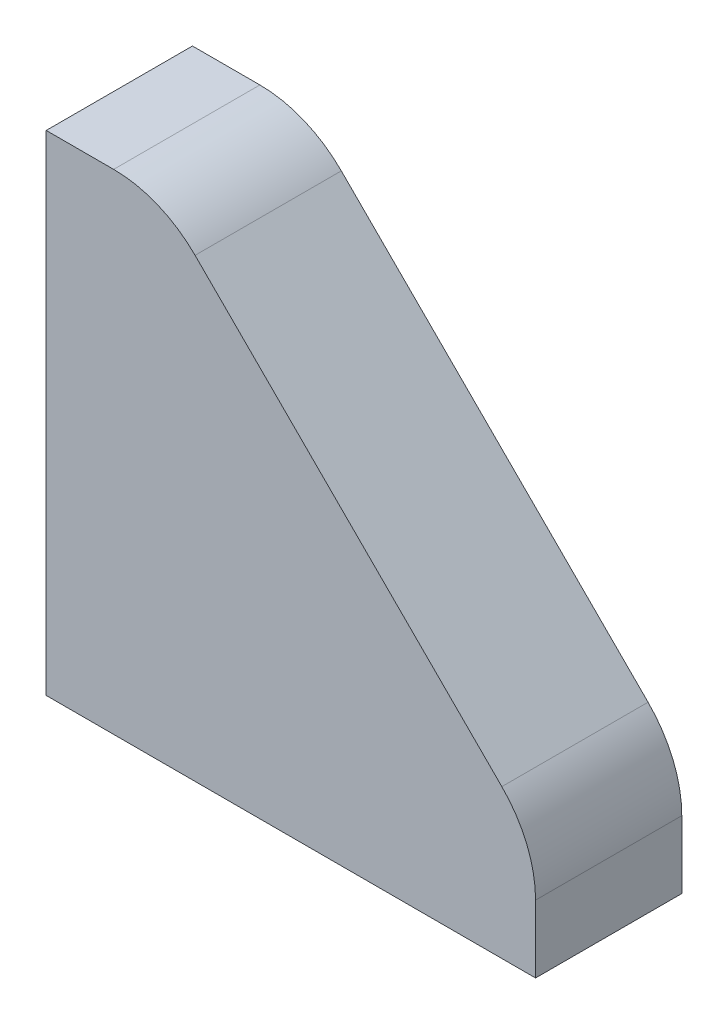
ISO-10303-21;
HEADER;
FILE_DESCRIPTION(('STEP AP214'),'2;1');
FILE_NAME('part.step','',(''),(''),'','','');
FILE_SCHEMA(('AUTOMOTIVE_DESIGN { 1 0 10303 214 1 1 1 1 }'));
ENDSEC;
DATA;
#1=APPLICATION_CONTEXT('core data for automotive mechanical design processes');
#2=APPLICATION_PROTOCOL_DEFINITION('international standard','automotive_design',2000,#1);
#3=PRODUCT_CONTEXT('',#1,'mechanical');
#4=PRODUCT('Part','Part','',(#3));
#5=PRODUCT_RELATED_PRODUCT_CATEGORY('part','',(#4));
#6=PRODUCT_DEFINITION_FORMATION('','',#4);
#7=PRODUCT_DEFINITION_CONTEXT('part definition',#1,'design');
#8=PRODUCT_DEFINITION('design','',#6,#7);
#9=PRODUCT_DEFINITION_SHAPE('','',#8);
#10=(LENGTH_UNIT() NAMED_UNIT(*) SI_UNIT(.MILLI.,.METRE.));
#11=(NAMED_UNIT(*) PLANE_ANGLE_UNIT() SI_UNIT($,.RADIAN.));
#12=(NAMED_UNIT(*) SI_UNIT($,.STERADIAN.) SOLID_ANGLE_UNIT());
#13=UNCERTAINTY_MEASURE_WITH_UNIT(LENGTH_MEASURE(1.E-05),#10,'distance_accuracy_value','');
#14=(GEOMETRIC_REPRESENTATION_CONTEXT(3) GLOBAL_UNCERTAINTY_ASSIGNED_CONTEXT((#13)) GLOBAL_UNIT_ASSIGNED_CONTEXT((#10,
#11,#12)) REPRESENTATION_CONTEXT('',''));
#15=CARTESIAN_POINT('',(0.,0.,0.));
#16=DIRECTION('',(0.,0.,1.));
#17=DIRECTION('',(1.,0.,0.));
#18=AXIS2_PLACEMENT_3D('',#15,#16,#17);
#19=CARTESIAN_POINT('',(0.,85.,12.7));
#20=DIRECTION('',(1.,0.,0.));
#21=DIRECTION('',(0.,1.,0.));
#22=AXIS2_PLACEMENT_3D('',#19,#20,#21);
#23=PLANE('',#22);
#24=DIRECTION('',(0.,-1.,0.));
#25=VECTOR('',#24,1.);
#26=CARTESIAN_POINT('',(0.,85.,-12.7));
#27=LINE('',#26,#25);
#28=CARTESIAN_POINT('',(0.,85.,-12.7));
#29=VERTEX_POINT('',#28);
#30=CARTESIAN_POINT('',(0.,0.,-12.7));
#31=VERTEX_POINT('',#30);
#32=EDGE_CURVE('E116',#29,#31,#27,.T.);
#33=ORIENTED_EDGE('',*,*,#32,.T.);
#34=DIRECTION('',(0.,0.,-1.));
#35=VECTOR('',#34,1.);
#36=CARTESIAN_POINT('',(0.,0.,12.7));
#37=LINE('',#36,#35);
#38=CARTESIAN_POINT('',(0.,0.,12.7));
#39=VERTEX_POINT('',#38);
#40=EDGE_CURVE('E100',#39,#31,#37,.T.);
#41=ORIENTED_EDGE('',*,*,#40,.F.);
#42=DIRECTION('',(0.,-1.,0.));
#43=VECTOR('',#42,1.);
#44=CARTESIAN_POINT('',(0.,85.,12.7));
#45=LINE('',#44,#43);
#46=CARTESIAN_POINT('',(0.,85.,12.7));
#47=VERTEX_POINT('',#46);
#48=EDGE_CURVE('E105',#47,#39,#45,.T.);
#49=ORIENTED_EDGE('',*,*,#48,.F.);
#50=DIRECTION('',(0.,0.,-1.));
#51=VECTOR('',#50,1.);
#52=CARTESIAN_POINT('',(0.,85.,12.7));
#53=LINE('',#52,#51);
#54=EDGE_CURVE('E121',#47,#29,#53,.T.);
#55=ORIENTED_EDGE('',*,*,#54,.T.);
#56=EDGE_LOOP('',(#33,#41,#49,#55));
#57=FACE_BOUND('',#56,.T.);
#58=ADVANCED_FACE('F34',(#57),#23,.F.);
#59=CARTESIAN_POINT('',(0.,0.,12.7));
#60=DIRECTION('',(0.,1.,0.));
#61=DIRECTION('',(0.,0.,1.));
#62=AXIS2_PLACEMENT_3D('',#59,#60,#61);
#63=PLANE('',#62);
#64=DIRECTION('',(1.,0.,0.));
#65=VECTOR('',#64,1.);
#66=CARTESIAN_POINT('',(0.,0.,-12.7));
#67=LINE('',#66,#65);
#68=CARTESIAN_POINT('',(85.,0.,-12.7));
#69=VERTEX_POINT('',#68);
#70=EDGE_CURVE('E150',#31,#69,#67,.T.);
#71=ORIENTED_EDGE('',*,*,#70,.T.);
#72=DIRECTION('',(0.,0.,-1.));
#73=VECTOR('',#72,1.);
#74=CARTESIAN_POINT('',(85.,0.,12.7));
#75=LINE('',#74,#73);
#76=CARTESIAN_POINT('',(85.,0.,12.7));
#77=VERTEX_POINT('',#76);
#78=EDGE_CURVE('E103',#77,#69,#75,.T.);
#79=ORIENTED_EDGE('',*,*,#78,.F.);
#80=DIRECTION('',(1.,0.,0.));
#81=VECTOR('',#80,1.);
#82=CARTESIAN_POINT('',(0.,0.,12.7));
#83=LINE('',#82,#81);
#84=EDGE_CURVE('E96',#39,#77,#83,.T.);
#85=ORIENTED_EDGE('',*,*,#84,.F.);
#86=ORIENTED_EDGE('',*,*,#40,.T.);
#87=EDGE_LOOP('',(#71,#79,#85,#86));
#88=FACE_BOUND('',#87,.T.);
#89=ADVANCED_FACE('F98',(#88),#63,.F.);
#90=CARTESIAN_POINT('',(85.,0.,12.7));
#91=DIRECTION('',(-1.,0.,0.));
#92=DIRECTION('',(0.,0.,1.));
#93=AXIS2_PLACEMENT_3D('',#90,#91,#92);
#94=PLANE('',#93);
#95=DIRECTION('',(0.,1.,0.));
#96=VECTOR('',#95,1.);
#97=CARTESIAN_POINT('',(85.,0.,-12.7));
#98=LINE('',#97,#96);
#99=CARTESIAN_POINT('',(85.,11.7157287525381,-12.7));
#100=VERTEX_POINT('',#99);
#101=EDGE_CURVE('E147',#69,#100,#98,.T.);
#102=ORIENTED_EDGE('',*,*,#101,.T.);
#103=DIRECTION('',(0.,0.,-1.));
#104=VECTOR('',#103,1.);
#105=CARTESIAN_POINT('',(85.,11.7157287525381,12.7));
#106=LINE('',#105,#104);
#107=CARTESIAN_POINT('',(85.,11.7157287525381,12.7));
#108=VERTEX_POINT('',#107);
#109=EDGE_CURVE('E57',#100,#108,#106,.F.);
#110=ORIENTED_EDGE('',*,*,#109,.T.);
#111=DIRECTION('',(0.,1.,0.));
#112=VECTOR('',#111,1.);
#113=CARTESIAN_POINT('',(85.,0.,12.7));
#114=LINE('',#113,#112);
#115=EDGE_CURVE('E104',#77,#108,#114,.T.);
#116=ORIENTED_EDGE('',*,*,#115,.F.);
#117=ORIENTED_EDGE('',*,*,#78,.T.);
#118=EDGE_LOOP('',(#102,#110,#116,#117));
#119=FACE_BOUND('',#118,.T.);
#120=ADVANCED_FACE('F149',(#119),#94,.F.);
#121=CARTESIAN_POINT('',(85.,20.,12.7));
#122=DIRECTION('',(-0.707106781186548,-0.707106781186548,0.));
#123=DIRECTION('',(0.707106781186548,-0.707106781186548,0.));
#124=AXIS2_PLACEMENT_3D('',#121,#122,#123);
#125=PLANE('',#124);
#126=DIRECTION('',(-0.707106781186547,0.707106781186547,0.));
#127=VECTOR('',#126,1.);
#128=CARTESIAN_POINT('',(85.,20.,12.7));
#129=LINE('',#128,#127);
#130=CARTESIAN_POINT('',(79.142135623731,25.857864376269,12.7));
#131=VERTEX_POINT('',#130);
#132=CARTESIAN_POINT('',(25.8578643762691,79.142135623731,12.7));
#133=VERTEX_POINT('',#132);
#134=EDGE_CURVE('E134',#131,#133,#129,.T.);
#135=ORIENTED_EDGE('',*,*,#134,.F.);
#136=DIRECTION('',(0.,0.,-1.));
#137=VECTOR('',#136,1.);
#138=CARTESIAN_POINT('',(79.142135623731,25.857864376269,12.7));
#139=LINE('',#138,#137);
#140=CARTESIAN_POINT('',(79.142135623731,25.857864376269,-12.7));
#141=VERTEX_POINT('',#140);
#142=EDGE_CURVE('E119',#131,#141,#139,.T.);
#143=ORIENTED_EDGE('',*,*,#142,.T.);
#144=DIRECTION('',(-0.707106781186547,0.707106781186547,0.));
#145=VECTOR('',#144,1.);
#146=CARTESIAN_POINT('',(85.,20.,-12.7));
#147=LINE('',#146,#145);
#148=CARTESIAN_POINT('',(25.8578643762691,79.142135623731,-12.7));
#149=VERTEX_POINT('',#148);
#150=EDGE_CURVE('E148',#141,#149,#147,.T.);
#151=ORIENTED_EDGE('',*,*,#150,.T.);
#152=DIRECTION('',(0.,0.,-1.));
#153=VECTOR('',#152,1.);
#154=CARTESIAN_POINT('',(25.8578643762691,79.142135623731,12.7));
#155=LINE('',#154,#153);
#156=EDGE_CURVE('E117',#149,#133,#155,.F.);
#157=ORIENTED_EDGE('',*,*,#156,.T.);
#158=EDGE_LOOP('',(#135,#143,#151,#157));
#159=FACE_BOUND('',#158,.T.);
#160=ADVANCED_FACE('F138',(#159),#125,.F.);
#161=CARTESIAN_POINT('',(20.,85.,12.7));
#162=DIRECTION('',(0.,-1.,0.));
#163=DIRECTION('',(0.,0.,-1.));
#164=AXIS2_PLACEMENT_3D('',#161,#162,#163);
#165=PLANE('',#164);
#166=DIRECTION('',(-1.,0.,0.));
#167=VECTOR('',#166,1.);
#168=CARTESIAN_POINT('',(20.,85.,12.7));
#169=LINE('',#168,#167);
#170=CARTESIAN_POINT('',(11.7157287525381,85.,12.7));
#171=VERTEX_POINT('',#170);
#172=EDGE_CURVE('E109',#171,#47,#169,.T.);
#173=ORIENTED_EDGE('',*,*,#172,.F.);
#174=DIRECTION('',(0.,0.,-1.));
#175=VECTOR('',#174,1.);
#176=CARTESIAN_POINT('',(11.7157287525381,85.,12.7));
#177=LINE('',#176,#175);
#178=CARTESIAN_POINT('',(11.7157287525381,85.,-12.7));
#179=VERTEX_POINT('',#178);
#180=EDGE_CURVE('E11',#171,#179,#177,.T.);
#181=ORIENTED_EDGE('',*,*,#180,.T.);
#182=DIRECTION('',(-1.,0.,0.));
#183=VECTOR('',#182,1.);
#184=CARTESIAN_POINT('',(20.,85.,-12.7));
#185=LINE('',#184,#183);
#186=EDGE_CURVE('E113',#179,#29,#185,.T.);
#187=ORIENTED_EDGE('',*,*,#186,.T.);
#188=ORIENTED_EDGE('',*,*,#54,.F.);
#189=EDGE_LOOP('',(#173,#181,#187,#188));
#190=FACE_BOUND('',#189,.T.);
#191=ADVANCED_FACE('F160',(#190),#165,.F.);
#192=CARTESIAN_POINT('',(0.,0.,12.7));
#193=DIRECTION('',(0.,0.,1.));
#194=DIRECTION('',(1.,0.,0.));
#195=AXIS2_PLACEMENT_3D('',#192,#193,#194);
#196=PLANE('',#195);
#197=ORIENTED_EDGE('',*,*,#115,.T.);
#198=CARTESIAN_POINT('',(65.,11.7157287525381,12.7));
#199=DIRECTION('',(0.,0.,1.));
#200=DIRECTION('',(1.,0.,0.));
#201=AXIS2_PLACEMENT_3D('',#198,#199,#200);
#202=CIRCLE('',#201,20.);
#203=EDGE_CURVE('E42',#108,#131,#202,.T.);
#204=ORIENTED_EDGE('',*,*,#203,.T.);
#205=ORIENTED_EDGE('',*,*,#134,.T.);
#206=CARTESIAN_POINT('',(11.7157287525381,65.,12.7));
#207=DIRECTION('',(0.,0.,1.));
#208=DIRECTION('',(1.,0.,0.));
#209=AXIS2_PLACEMENT_3D('',#206,#207,#208);
#210=CIRCLE('',#209,20.);
#211=EDGE_CURVE('E49',#133,#171,#210,.T.);
#212=ORIENTED_EDGE('',*,*,#211,.T.);
#213=ORIENTED_EDGE('',*,*,#172,.T.);
#214=ORIENTED_EDGE('',*,*,#48,.T.);
#215=ORIENTED_EDGE('',*,*,#84,.T.);
#216=EDGE_LOOP('',(#197,#204,#205,#212,#213,#214,#215));
#217=FACE_BOUND('',#216,.T.);
#218=ADVANCED_FACE('F108',(#217),#196,.T.);
#219=CARTESIAN_POINT('',(0.,0.,-12.7));
#220=DIRECTION('',(0.,0.,1.));
#221=DIRECTION('',(1.,0.,0.));
#222=AXIS2_PLACEMENT_3D('',#219,#220,#221);
#223=PLANE('',#222);
#224=ORIENTED_EDGE('',*,*,#150,.F.);
#225=CARTESIAN_POINT('',(65.,11.7157287525381,-12.7));
#226=DIRECTION('',(0.,0.,1.));
#227=DIRECTION('',(1.,0.,0.));
#228=AXIS2_PLACEMENT_3D('',#225,#226,#227);
#229=CIRCLE('',#228,20.);
#230=EDGE_CURVE('E129',#141,#100,#229,.F.);
#231=ORIENTED_EDGE('',*,*,#230,.T.);
#232=ORIENTED_EDGE('',*,*,#101,.F.);
#233=ORIENTED_EDGE('',*,*,#70,.F.);
#234=ORIENTED_EDGE('',*,*,#32,.F.);
#235=ORIENTED_EDGE('',*,*,#186,.F.);
#236=CARTESIAN_POINT('',(11.7157287525381,65.,-12.7));
#237=DIRECTION('',(0.,0.,1.));
#238=DIRECTION('',(1.,0.,0.));
#239=AXIS2_PLACEMENT_3D('',#236,#237,#238);
#240=CIRCLE('',#239,20.);
#241=EDGE_CURVE('E127',#179,#149,#240,.F.);
#242=ORIENTED_EDGE('',*,*,#241,.T.);
#243=EDGE_LOOP('',(#224,#231,#232,#233,#234,#235,#242));
#244=FACE_BOUND('',#243,.T.);
#245=ADVANCED_FACE('F146',(#244),#223,.F.);
#246=CARTESIAN_POINT('',(65.,11.7157287525381,12.7));
#247=DIRECTION('',(0.,0.,-1.));
#248=DIRECTION('',(-1.,0.,0.));
#249=AXIS2_PLACEMENT_3D('',#246,#247,#248);
#250=CYLINDRICAL_SURFACE('',#249,20.);
#251=ORIENTED_EDGE('',*,*,#203,.F.);
#252=ORIENTED_EDGE('',*,*,#109,.F.);
#253=ORIENTED_EDGE('',*,*,#230,.F.);
#254=ORIENTED_EDGE('',*,*,#142,.F.);
#255=EDGE_LOOP('',(#251,#252,#253,#254));
#256=FACE_BOUND('',#255,.T.);
#257=ADVANCED_FACE('F143',(#256),#250,.T.);
#258=CARTESIAN_POINT('',(11.7157287525381,65.,12.7));
#259=DIRECTION('',(0.,0.,-1.));
#260=DIRECTION('',(-1.,0.,0.));
#261=AXIS2_PLACEMENT_3D('',#258,#259,#260);
#262=CYLINDRICAL_SURFACE('',#261,20.);
#263=ORIENTED_EDGE('',*,*,#211,.F.);
#264=ORIENTED_EDGE('',*,*,#156,.F.);
#265=ORIENTED_EDGE('',*,*,#241,.F.);
#266=ORIENTED_EDGE('',*,*,#180,.F.);
#267=EDGE_LOOP('',(#263,#264,#265,#266));
#268=FACE_BOUND('',#267,.T.);
#269=ADVANCED_FACE('F36',(#268),#262,.T.);
#270=CLOSED_SHELL('',(#58,#89,#120,#160,#191,#218,#245,#257,#269));
#271=MANIFOLD_SOLID_BREP('B2',#270);
#272=ADVANCED_BREP_SHAPE_REPRESENTATION('',(#18,#271),#14);
#273=SHAPE_DEFINITION_REPRESENTATION(#9,#272);
ENDSEC;
END-ISO-10303-21;
